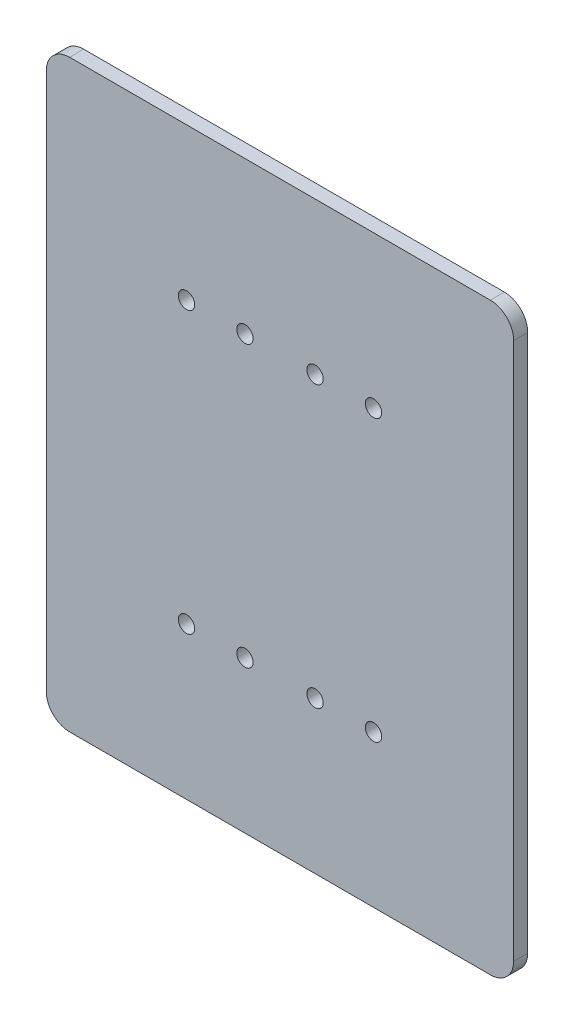
ISO-10303-21;
HEADER;
FILE_DESCRIPTION(('STEP AP214'),'2;1');
FILE_NAME('part.step','',(''),(''),'','','');
FILE_SCHEMA(('AUTOMOTIVE_DESIGN { 1 0 10303 214 1 1 1 1 }'));
ENDSEC;
DATA;
#1=APPLICATION_CONTEXT('core data for automotive mechanical design processes');
#2=APPLICATION_PROTOCOL_DEFINITION('international standard','automotive_design',2000,#1);
#3=PRODUCT_CONTEXT('',#1,'mechanical');
#4=PRODUCT('Part','Part','',(#3));
#5=PRODUCT_RELATED_PRODUCT_CATEGORY('part','',(#4));
#6=PRODUCT_DEFINITION_FORMATION('','',#4);
#7=PRODUCT_DEFINITION_CONTEXT('part definition',#1,'design');
#8=PRODUCT_DEFINITION('design','',#6,#7);
#9=PRODUCT_DEFINITION_SHAPE('','',#8);
#10=(LENGTH_UNIT() NAMED_UNIT(*) SI_UNIT(.MILLI.,.METRE.));
#11=(NAMED_UNIT(*) PLANE_ANGLE_UNIT() SI_UNIT($,.RADIAN.));
#12=(NAMED_UNIT(*) SI_UNIT($,.STERADIAN.) SOLID_ANGLE_UNIT());
#13=UNCERTAINTY_MEASURE_WITH_UNIT(LENGTH_MEASURE(1.E-05),#10,'distance_accuracy_value','');
#14=(GEOMETRIC_REPRESENTATION_CONTEXT(3) GLOBAL_UNCERTAINTY_ASSIGNED_CONTEXT((#13)) GLOBAL_UNIT_ASSIGNED_CONTEXT((#10,
#11,#12)) REPRESENTATION_CONTEXT('',''));
#15=CARTESIAN_POINT('',(0.,0.,0.));
#16=DIRECTION('',(0.,0.,1.));
#17=DIRECTION('',(1.,0.,0.));
#18=AXIS2_PLACEMENT_3D('',#15,#16,#17);
#19=CARTESIAN_POINT('',(0.,0.,6.));
#20=DIRECTION('',(1.,0.,0.));
#21=DIRECTION('',(0.,0.,-1.));
#22=AXIS2_PLACEMENT_3D('',#19,#20,#21);
#23=PLANE('',#22);
#24=DIRECTION('',(0.,-1.,0.));
#25=VECTOR('',#24,1.);
#26=CARTESIAN_POINT('',(0.,0.,6.));
#27=LINE('',#26,#25);
#28=CARTESIAN_POINT('',(0.,240.,6.));
#29=VERTEX_POINT('',#28);
#30=CARTESIAN_POINT('',(0.,10.,6.));
#31=VERTEX_POINT('',#30);
#32=EDGE_CURVE('E121',#29,#31,#27,.T.);
#33=ORIENTED_EDGE('',*,*,#32,.F.);
#34=DIRECTION('',(0.,0.,-1.));
#35=VECTOR('',#34,1.);
#36=CARTESIAN_POINT('',(0.,240.,6.));
#37=LINE('',#36,#35);
#38=CARTESIAN_POINT('',(0.,240.,0.));
#39=VERTEX_POINT('',#38);
#40=EDGE_CURVE('E106',#29,#39,#37,.T.);
#41=ORIENTED_EDGE('',*,*,#40,.T.);
#42=DIRECTION('',(0.,-1.,0.));
#43=VECTOR('',#42,1.);
#44=CARTESIAN_POINT('',(0.,0.,0.));
#45=LINE('',#44,#43);
#46=CARTESIAN_POINT('',(0.,10.,0.));
#47=VERTEX_POINT('',#46);
#48=EDGE_CURVE('E118',#39,#47,#45,.T.);
#49=ORIENTED_EDGE('',*,*,#48,.T.);
#50=DIRECTION('',(0.,0.,-1.));
#51=VECTOR('',#50,1.);
#52=CARTESIAN_POINT('',(0.,10.,6.));
#53=LINE('',#52,#51);
#54=EDGE_CURVE('E123',#47,#31,#53,.F.);
#55=ORIENTED_EDGE('',*,*,#54,.T.);
#56=EDGE_LOOP('',(#33,#41,#49,#55));
#57=FACE_BOUND('',#56,.T.);
#58=ADVANCED_FACE('F36',(#57),#23,.F.);
#59=CARTESIAN_POINT('',(0.,0.,6.));
#60=DIRECTION('',(0.,1.,0.));
#61=DIRECTION('',(-1.,0.,0.));
#62=AXIS2_PLACEMENT_3D('',#59,#60,#61);
#63=PLANE('',#62);
#64=DIRECTION('',(1.,0.,0.));
#65=VECTOR('',#64,1.);
#66=CARTESIAN_POINT('',(0.,0.,0.));
#67=LINE('',#66,#65);
#68=CARTESIAN_POINT('',(10.,0.,0.));
#69=VERTEX_POINT('',#68);
#70=CARTESIAN_POINT('',(190.,0.,0.));
#71=VERTEX_POINT('',#70);
#72=EDGE_CURVE('E127',#69,#71,#67,.T.);
#73=ORIENTED_EDGE('',*,*,#72,.T.);
#74=DIRECTION('',(0.,0.,-1.));
#75=VECTOR('',#74,1.);
#76=CARTESIAN_POINT('',(190.,0.,6.));
#77=LINE('',#76,#75);
#78=CARTESIAN_POINT('',(190.,0.,6.));
#79=VERTEX_POINT('',#78);
#80=EDGE_CURVE('E11',#71,#79,#77,.F.);
#81=ORIENTED_EDGE('',*,*,#80,.T.);
#82=DIRECTION('',(1.,0.,0.));
#83=VECTOR('',#82,1.);
#84=CARTESIAN_POINT('',(0.,0.,6.));
#85=LINE('',#84,#83);
#86=CARTESIAN_POINT('',(10.,0.,6.));
#87=VERTEX_POINT('',#86);
#88=EDGE_CURVE('E167',#87,#79,#85,.T.);
#89=ORIENTED_EDGE('',*,*,#88,.F.);
#90=DIRECTION('',(0.,0.,-1.));
#91=VECTOR('',#90,1.);
#92=CARTESIAN_POINT('',(10.,0.,6.));
#93=LINE('',#92,#91);
#94=EDGE_CURVE('E44',#87,#69,#93,.T.);
#95=ORIENTED_EDGE('',*,*,#94,.T.);
#96=EDGE_LOOP('',(#73,#81,#89,#95));
#97=FACE_BOUND('',#96,.T.);
#98=ADVANCED_FACE('F165',(#97),#63,.F.);
#99=CARTESIAN_POINT('',(200.,0.,6.));
#100=DIRECTION('',(-1.,0.,0.));
#101=DIRECTION('',(0.,-1.,0.));
#102=AXIS2_PLACEMENT_3D('',#99,#100,#101);
#103=PLANE('',#102);
#104=DIRECTION('',(0.,1.,0.));
#105=VECTOR('',#104,1.);
#106=CARTESIAN_POINT('',(200.,0.,0.));
#107=LINE('',#106,#105);
#108=CARTESIAN_POINT('',(200.,10.,0.));
#109=VERTEX_POINT('',#108);
#110=CARTESIAN_POINT('',(200.,240.,0.));
#111=VERTEX_POINT('',#110);
#112=EDGE_CURVE('E131',#109,#111,#107,.T.);
#113=ORIENTED_EDGE('',*,*,#112,.T.);
#114=DIRECTION('',(0.,0.,-1.));
#115=VECTOR('',#114,1.);
#116=CARTESIAN_POINT('',(200.,240.,6.));
#117=LINE('',#116,#115);
#118=CARTESIAN_POINT('',(200.,240.,6.));
#119=VERTEX_POINT('',#118);
#120=EDGE_CURVE('E51',#111,#119,#117,.F.);
#121=ORIENTED_EDGE('',*,*,#120,.T.);
#122=DIRECTION('',(0.,1.,0.));
#123=VECTOR('',#122,1.);
#124=CARTESIAN_POINT('',(200.,0.,6.));
#125=LINE('',#124,#123);
#126=CARTESIAN_POINT('',(200.,10.,6.));
#127=VERTEX_POINT('',#126);
#128=EDGE_CURVE('E175',#127,#119,#125,.T.);
#129=ORIENTED_EDGE('',*,*,#128,.F.);
#130=DIRECTION('',(0.,0.,-1.));
#131=VECTOR('',#130,1.);
#132=CARTESIAN_POINT('',(200.,10.,6.));
#133=LINE('',#132,#131);
#134=EDGE_CURVE('E158',#127,#109,#133,.T.);
#135=ORIENTED_EDGE('',*,*,#134,.T.);
#136=EDGE_LOOP('',(#113,#121,#129,#135));
#137=FACE_BOUND('',#136,.T.);
#138=ADVANCED_FACE('F174',(#137),#103,.F.);
#139=CARTESIAN_POINT('',(0.,250.,6.));
#140=DIRECTION('',(0.,-1.,0.));
#141=DIRECTION('',(0.,0.,-1.));
#142=AXIS2_PLACEMENT_3D('',#139,#140,#141);
#143=PLANE('',#142);
#144=DIRECTION('',(-1.,0.,0.));
#145=VECTOR('',#144,1.);
#146=CARTESIAN_POINT('',(0.,250.,0.));
#147=LINE('',#146,#145);
#148=CARTESIAN_POINT('',(190.,250.,0.));
#149=VERTEX_POINT('',#148);
#150=CARTESIAN_POINT('',(10.,250.,0.));
#151=VERTEX_POINT('',#150);
#152=EDGE_CURVE('E141',#149,#151,#147,.T.);
#153=ORIENTED_EDGE('',*,*,#152,.T.);
#154=DIRECTION('',(0.,0.,-1.));
#155=VECTOR('',#154,1.);
#156=CARTESIAN_POINT('',(10.,250.,6.));
#157=LINE('',#156,#155);
#158=CARTESIAN_POINT('',(10.,250.,6.));
#159=VERTEX_POINT('',#158);
#160=EDGE_CURVE('E107',#151,#159,#157,.F.);
#161=ORIENTED_EDGE('',*,*,#160,.T.);
#162=DIRECTION('',(-1.,0.,0.));
#163=VECTOR('',#162,1.);
#164=CARTESIAN_POINT('',(0.,250.,6.));
#165=LINE('',#164,#163);
#166=CARTESIAN_POINT('',(190.,250.,6.));
#167=VERTEX_POINT('',#166);
#168=EDGE_CURVE('E137',#167,#159,#165,.T.);
#169=ORIENTED_EDGE('',*,*,#168,.F.);
#170=DIRECTION('',(0.,0.,-1.));
#171=VECTOR('',#170,1.);
#172=CARTESIAN_POINT('',(190.,250.,6.));
#173=LINE('',#172,#171);
#174=EDGE_CURVE('E112',#167,#149,#173,.T.);
#175=ORIENTED_EDGE('',*,*,#174,.T.);
#176=EDGE_LOOP('',(#153,#161,#169,#175));
#177=FACE_BOUND('',#176,.T.);
#178=ADVANCED_FACE('F275',(#177),#143,.F.);
#179=CARTESIAN_POINT('',(0.,0.,6.));
#180=DIRECTION('',(0.,0.,-1.));
#181=DIRECTION('',(-1.,0.,0.));
#182=AXIS2_PLACEMENT_3D('',#179,#180,#181);
#183=PLANE('',#182);
#184=CARTESIAN_POINT('',(140.,185.,6.));
#185=DIRECTION('',(0.,0.,-1.));
#186=DIRECTION('',(-1.,0.,0.));
#187=AXIS2_PLACEMENT_3D('',#184,#185,#186);
#188=CIRCLE('',#187,3.49999999999999);
#189=CARTESIAN_POINT('',(136.5,185.,6.));
#190=VERTEX_POINT('',#189);
#191=EDGE_CURVE('E196',#190,#190,#188,.F.);
#192=ORIENTED_EDGE('',*,*,#191,.F.);
#193=EDGE_LOOP('',(#192));
#194=FACE_BOUND('',#193,.T.);
#195=CARTESIAN_POINT('',(115.,65.,6.));
#196=DIRECTION('',(0.,0.,-1.));
#197=DIRECTION('',(-1.,0.,0.));
#198=AXIS2_PLACEMENT_3D('',#195,#196,#197);
#199=CIRCLE('',#198,3.50000000000001);
#200=CARTESIAN_POINT('',(111.5,65.,6.));
#201=VERTEX_POINT('',#200);
#202=EDGE_CURVE('E191',#201,#201,#199,.F.);
#203=ORIENTED_EDGE('',*,*,#202,.F.);
#204=EDGE_LOOP('',(#203));
#205=FACE_BOUND('',#204,.T.);
#206=CARTESIAN_POINT('',(140.,65.,6.));
#207=DIRECTION('',(0.,0.,-1.));
#208=DIRECTION('',(-1.,0.,0.));
#209=AXIS2_PLACEMENT_3D('',#206,#207,#208);
#210=CIRCLE('',#209,3.49999999999999);
#211=CARTESIAN_POINT('',(136.5,65.,6.));
#212=VERTEX_POINT('',#211);
#213=EDGE_CURVE('E184',#212,#212,#210,.F.);
#214=ORIENTED_EDGE('',*,*,#213,.F.);
#215=EDGE_LOOP('',(#214));
#216=FACE_BOUND('',#215,.T.);
#217=CARTESIAN_POINT('',(85.,65.,6.));
#218=DIRECTION('',(0.,0.,-1.));
#219=DIRECTION('',(-1.,0.,0.));
#220=AXIS2_PLACEMENT_3D('',#217,#218,#219);
#221=CIRCLE('',#220,3.50000000000001);
#222=CARTESIAN_POINT('',(81.5,65.,6.));
#223=VERTEX_POINT('',#222);
#224=EDGE_CURVE('E183',#223,#223,#221,.F.);
#225=ORIENTED_EDGE('',*,*,#224,.F.);
#226=EDGE_LOOP('',(#225));
#227=FACE_BOUND('',#226,.T.);
#228=CARTESIAN_POINT('',(115.,185.,6.));
#229=DIRECTION('',(0.,0.,-1.));
#230=DIRECTION('',(-1.,0.,0.));
#231=AXIS2_PLACEMENT_3D('',#228,#229,#230);
#232=CIRCLE('',#231,3.50000000000001);
#233=CARTESIAN_POINT('',(111.5,185.,6.));
#234=VERTEX_POINT('',#233);
#235=EDGE_CURVE('E203',#234,#234,#232,.F.);
#236=ORIENTED_EDGE('',*,*,#235,.F.);
#237=EDGE_LOOP('',(#236));
#238=FACE_BOUND('',#237,.T.);
#239=CARTESIAN_POINT('',(85.,185.,6.));
#240=DIRECTION('',(0.,0.,-1.));
#241=DIRECTION('',(-1.,0.,0.));
#242=AXIS2_PLACEMENT_3D('',#239,#240,#241);
#243=CIRCLE('',#242,3.50000000000001);
#244=CARTESIAN_POINT('',(81.5,185.,6.));
#245=VERTEX_POINT('',#244);
#246=EDGE_CURVE('E215',#245,#245,#243,.F.);
#247=ORIENTED_EDGE('',*,*,#246,.F.);
#248=EDGE_LOOP('',(#247));
#249=FACE_BOUND('',#248,.T.);
#250=CARTESIAN_POINT('',(60.,185.,6.));
#251=DIRECTION('',(0.,0.,-1.));
#252=DIRECTION('',(-1.,0.,0.));
#253=AXIS2_PLACEMENT_3D('',#250,#251,#252);
#254=CIRCLE('',#253,3.5);
#255=CARTESIAN_POINT('',(56.5,185.,6.));
#256=VERTEX_POINT('',#255);
#257=EDGE_CURVE('E208',#256,#256,#254,.F.);
#258=ORIENTED_EDGE('',*,*,#257,.F.);
#259=EDGE_LOOP('',(#258));
#260=FACE_BOUND('',#259,.T.);
#261=CARTESIAN_POINT('',(60.,65.,6.));
#262=DIRECTION('',(0.,0.,-1.));
#263=DIRECTION('',(-1.,0.,0.));
#264=AXIS2_PLACEMENT_3D('',#261,#262,#263);
#265=CIRCLE('',#264,3.5);
#266=CARTESIAN_POINT('',(56.5,65.,6.));
#267=VERTEX_POINT('',#266);
#268=EDGE_CURVE('E128',#267,#267,#265,.F.);
#269=ORIENTED_EDGE('',*,*,#268,.F.);
#270=EDGE_LOOP('',(#269));
#271=FACE_BOUND('',#270,.T.);
#272=ORIENTED_EDGE('',*,*,#168,.T.);
#273=CARTESIAN_POINT('',(10.,240.,6.));
#274=DIRECTION('',(0.,0.,-1.));
#275=DIRECTION('',(-1.,0.,0.));
#276=AXIS2_PLACEMENT_3D('',#273,#274,#275);
#277=CIRCLE('',#276,10.);
#278=EDGE_CURVE('E156',#159,#29,#277,.F.);
#279=ORIENTED_EDGE('',*,*,#278,.T.);
#280=ORIENTED_EDGE('',*,*,#32,.T.);
#281=CARTESIAN_POINT('',(10.,10.,6.));
#282=DIRECTION('',(0.,0.,-1.));
#283=DIRECTION('',(-1.,0.,0.));
#284=AXIS2_PLACEMENT_3D('',#281,#282,#283);
#285=CIRCLE('',#284,10.);
#286=EDGE_CURVE('E151',#31,#87,#285,.F.);
#287=ORIENTED_EDGE('',*,*,#286,.T.);
#288=ORIENTED_EDGE('',*,*,#88,.T.);
#289=CARTESIAN_POINT('',(190.,10.,6.));
#290=DIRECTION('',(0.,0.,-1.));
#291=DIRECTION('',(-1.,0.,0.));
#292=AXIS2_PLACEMENT_3D('',#289,#290,#291);
#293=CIRCLE('',#292,10.);
#294=EDGE_CURVE('E58',#79,#127,#293,.F.);
#295=ORIENTED_EDGE('',*,*,#294,.T.);
#296=ORIENTED_EDGE('',*,*,#128,.T.);
#297=CARTESIAN_POINT('',(190.,240.,6.));
#298=DIRECTION('',(0.,0.,-1.));
#299=DIRECTION('',(-1.,0.,0.));
#300=AXIS2_PLACEMENT_3D('',#297,#298,#299);
#301=CIRCLE('',#300,10.);
#302=EDGE_CURVE('E154',#119,#167,#301,.F.);
#303=ORIENTED_EDGE('',*,*,#302,.T.);
#304=EDGE_LOOP('',(#272,#279,#280,#287,#288,#295,#296,#303));
#305=FACE_BOUND('',#304,.T.);
#306=ADVANCED_FACE('F231',(#194,#205,#216,#227,#238,#249,#260,#271,#305),#183,.F.);
#307=CARTESIAN_POINT('',(0.,0.,0.));
#308=DIRECTION('',(0.,0.,-1.));
#309=DIRECTION('',(-1.,0.,0.));
#310=AXIS2_PLACEMENT_3D('',#307,#308,#309);
#311=PLANE('',#310);
#312=CARTESIAN_POINT('',(140.,185.,0.));
#313=DIRECTION('',(0.,0.,-1.));
#314=DIRECTION('',(-1.,0.,0.));
#315=AXIS2_PLACEMENT_3D('',#312,#313,#314);
#316=CIRCLE('',#315,3.49999999999999);
#317=CARTESIAN_POINT('',(136.5,185.,0.));
#318=VERTEX_POINT('',#317);
#319=EDGE_CURVE('E200',#318,#318,#316,.T.);
#320=ORIENTED_EDGE('',*,*,#319,.F.);
#321=EDGE_LOOP('',(#320));
#322=FACE_BOUND('',#321,.T.);
#323=CARTESIAN_POINT('',(115.,65.,0.));
#324=DIRECTION('',(0.,0.,-1.));
#325=DIRECTION('',(-1.,0.,0.));
#326=AXIS2_PLACEMENT_3D('',#323,#324,#325);
#327=CIRCLE('',#326,3.50000000000001);
#328=CARTESIAN_POINT('',(111.5,65.,0.));
#329=VERTEX_POINT('',#328);
#330=EDGE_CURVE('E199',#329,#329,#327,.T.);
#331=ORIENTED_EDGE('',*,*,#330,.F.);
#332=EDGE_LOOP('',(#331));
#333=FACE_BOUND('',#332,.T.);
#334=CARTESIAN_POINT('',(140.,65.,0.));
#335=DIRECTION('',(0.,0.,-1.));
#336=DIRECTION('',(-1.,0.,0.));
#337=AXIS2_PLACEMENT_3D('',#334,#335,#336);
#338=CIRCLE('',#337,3.49999999999999);
#339=CARTESIAN_POINT('',(136.5,65.,0.));
#340=VERTEX_POINT('',#339);
#341=EDGE_CURVE('E188',#340,#340,#338,.T.);
#342=ORIENTED_EDGE('',*,*,#341,.F.);
#343=EDGE_LOOP('',(#342));
#344=FACE_BOUND('',#343,.T.);
#345=CARTESIAN_POINT('',(85.,65.,0.));
#346=DIRECTION('',(0.,0.,-1.));
#347=DIRECTION('',(-1.,0.,0.));
#348=AXIS2_PLACEMENT_3D('',#345,#346,#347);
#349=CIRCLE('',#348,3.50000000000001);
#350=CARTESIAN_POINT('',(81.5,65.,0.));
#351=VERTEX_POINT('',#350);
#352=EDGE_CURVE('E187',#351,#351,#349,.T.);
#353=ORIENTED_EDGE('',*,*,#352,.F.);
#354=EDGE_LOOP('',(#353));
#355=FACE_BOUND('',#354,.T.);
#356=CARTESIAN_POINT('',(115.,185.,0.));
#357=DIRECTION('',(0.,0.,-1.));
#358=DIRECTION('',(-1.,0.,0.));
#359=AXIS2_PLACEMENT_3D('',#356,#357,#358);
#360=CIRCLE('',#359,3.50000000000001);
#361=CARTESIAN_POINT('',(111.5,185.,0.));
#362=VERTEX_POINT('',#361);
#363=EDGE_CURVE('E218',#362,#362,#360,.T.);
#364=ORIENTED_EDGE('',*,*,#363,.F.);
#365=EDGE_LOOP('',(#364));
#366=FACE_BOUND('',#365,.T.);
#367=CARTESIAN_POINT('',(85.,185.,0.));
#368=DIRECTION('',(0.,0.,-1.));
#369=DIRECTION('',(-1.,0.,0.));
#370=AXIS2_PLACEMENT_3D('',#367,#368,#369);
#371=CIRCLE('',#370,3.50000000000001);
#372=CARTESIAN_POINT('',(81.5,185.,0.));
#373=VERTEX_POINT('',#372);
#374=EDGE_CURVE('E211',#373,#373,#371,.T.);
#375=ORIENTED_EDGE('',*,*,#374,.F.);
#376=EDGE_LOOP('',(#375));
#377=FACE_BOUND('',#376,.T.);
#378=CARTESIAN_POINT('',(60.,185.,0.));
#379=DIRECTION('',(0.,0.,-1.));
#380=DIRECTION('',(-1.,0.,0.));
#381=AXIS2_PLACEMENT_3D('',#378,#379,#380);
#382=CIRCLE('',#381,3.5);
#383=CARTESIAN_POINT('',(56.5,185.,0.));
#384=VERTEX_POINT('',#383);
#385=EDGE_CURVE('E212',#384,#384,#382,.T.);
#386=ORIENTED_EDGE('',*,*,#385,.F.);
#387=EDGE_LOOP('',(#386));
#388=FACE_BOUND('',#387,.T.);
#389=CARTESIAN_POINT('',(60.,65.,0.));
#390=DIRECTION('',(0.,0.,-1.));
#391=DIRECTION('',(-1.,0.,0.));
#392=AXIS2_PLACEMENT_3D('',#389,#390,#391);
#393=CIRCLE('',#392,3.5);
#394=CARTESIAN_POINT('',(56.5,65.,0.));
#395=VERTEX_POINT('',#394);
#396=EDGE_CURVE('E134',#395,#395,#393,.T.);
#397=ORIENTED_EDGE('',*,*,#396,.F.);
#398=EDGE_LOOP('',(#397));
#399=FACE_BOUND('',#398,.T.);
#400=ORIENTED_EDGE('',*,*,#48,.F.);
#401=CARTESIAN_POINT('',(10.,240.,0.));
#402=DIRECTION('',(0.,0.,-1.));
#403=DIRECTION('',(-1.,0.,0.));
#404=AXIS2_PLACEMENT_3D('',#401,#402,#403);
#405=CIRCLE('',#404,10.);
#406=EDGE_CURVE('E102',#39,#151,#405,.T.);
#407=ORIENTED_EDGE('',*,*,#406,.T.);
#408=ORIENTED_EDGE('',*,*,#152,.F.);
#409=CARTESIAN_POINT('',(190.,240.,0.));
#410=DIRECTION('',(0.,0.,-1.));
#411=DIRECTION('',(-1.,0.,0.));
#412=AXIS2_PLACEMENT_3D('',#409,#410,#411);
#413=CIRCLE('',#412,10.);
#414=EDGE_CURVE('E113',#149,#111,#413,.T.);
#415=ORIENTED_EDGE('',*,*,#414,.T.);
#416=ORIENTED_EDGE('',*,*,#112,.F.);
#417=CARTESIAN_POINT('',(190.,10.,0.));
#418=DIRECTION('',(0.,0.,-1.));
#419=DIRECTION('',(-1.,0.,0.));
#420=AXIS2_PLACEMENT_3D('',#417,#418,#419);
#421=CIRCLE('',#420,10.);
#422=EDGE_CURVE('E145',#109,#71,#421,.T.);
#423=ORIENTED_EDGE('',*,*,#422,.T.);
#424=ORIENTED_EDGE('',*,*,#72,.F.);
#425=CARTESIAN_POINT('',(10.,10.,0.));
#426=DIRECTION('',(0.,0.,-1.));
#427=DIRECTION('',(-1.,0.,0.));
#428=AXIS2_PLACEMENT_3D('',#425,#426,#427);
#429=CIRCLE('',#428,10.);
#430=EDGE_CURVE('E122',#69,#47,#429,.T.);
#431=ORIENTED_EDGE('',*,*,#430,.T.);
#432=EDGE_LOOP('',(#400,#407,#408,#415,#416,#423,#424,#431));
#433=FACE_BOUND('',#432,.T.);
#434=ADVANCED_FACE('F125',(#322,#333,#344,#355,#366,#377,#388,#399,#433),#311,.T.);
#435=CARTESIAN_POINT('',(60.,65.,15.8994949366117));
#436=DIRECTION('',(0.,0.,-1.));
#437=DIRECTION('',(-1.,0.,0.));
#438=AXIS2_PLACEMENT_3D('',#435,#436,#437);
#439=CYLINDRICAL_SURFACE('',#438,3.5);
#440=ORIENTED_EDGE('',*,*,#268,.T.);
#441=EDGE_LOOP('',(#440));
#442=FACE_BOUND('',#441,.T.);
#443=ORIENTED_EDGE('',*,*,#396,.T.);
#444=EDGE_LOOP('',(#443));
#445=FACE_BOUND('',#444,.T.);
#446=ADVANCED_FACE('F230',(#442,#445),#439,.F.);
#447=CARTESIAN_POINT('',(60.,185.,15.8994949366117));
#448=DIRECTION('',(0.,0.,-1.));
#449=DIRECTION('',(-1.,0.,0.));
#450=AXIS2_PLACEMENT_3D('',#447,#448,#449);
#451=CYLINDRICAL_SURFACE('',#450,3.5);
#452=ORIENTED_EDGE('',*,*,#257,.T.);
#453=EDGE_LOOP('',(#452));
#454=FACE_BOUND('',#453,.T.);
#455=ORIENTED_EDGE('',*,*,#385,.T.);
#456=EDGE_LOOP('',(#455));
#457=FACE_BOUND('',#456,.T.);
#458=ADVANCED_FACE('F241',(#454,#457),#451,.F.);
#459=CARTESIAN_POINT('',(85.,185.,15.8994949366117));
#460=DIRECTION('',(0.,0.,-1.));
#461=DIRECTION('',(-1.,0.,0.));
#462=AXIS2_PLACEMENT_3D('',#459,#460,#461);
#463=CYLINDRICAL_SURFACE('',#462,3.50000000000001);
#464=ORIENTED_EDGE('',*,*,#246,.T.);
#465=EDGE_LOOP('',(#464));
#466=FACE_BOUND('',#465,.T.);
#467=ORIENTED_EDGE('',*,*,#374,.T.);
#468=EDGE_LOOP('',(#467));
#469=FACE_BOUND('',#468,.T.);
#470=ADVANCED_FACE('F247',(#466,#469),#463,.F.);
#471=CARTESIAN_POINT('',(115.,185.,15.8994949366117));
#472=DIRECTION('',(0.,0.,-1.));
#473=DIRECTION('',(-1.,0.,0.));
#474=AXIS2_PLACEMENT_3D('',#471,#472,#473);
#475=CYLINDRICAL_SURFACE('',#474,3.50000000000001);
#476=ORIENTED_EDGE('',*,*,#235,.T.);
#477=EDGE_LOOP('',(#476));
#478=FACE_BOUND('',#477,.T.);
#479=ORIENTED_EDGE('',*,*,#363,.T.);
#480=EDGE_LOOP('',(#479));
#481=FACE_BOUND('',#480,.T.);
#482=ADVANCED_FACE('F226',(#478,#481),#475,.F.);
#483=CARTESIAN_POINT('',(85.,65.,15.8994949366117));
#484=DIRECTION('',(0.,0.,-1.));
#485=DIRECTION('',(-1.,0.,0.));
#486=AXIS2_PLACEMENT_3D('',#483,#484,#485);
#487=CYLINDRICAL_SURFACE('',#486,3.50000000000001);
#488=ORIENTED_EDGE('',*,*,#224,.T.);
#489=EDGE_LOOP('',(#488));
#490=FACE_BOUND('',#489,.T.);
#491=ORIENTED_EDGE('',*,*,#352,.T.);
#492=EDGE_LOOP('',(#491));
#493=FACE_BOUND('',#492,.T.);
#494=ADVANCED_FACE('F323',(#490,#493),#487,.F.);
#495=CARTESIAN_POINT('',(140.,65.,15.8994949366117));
#496=DIRECTION('',(0.,0.,-1.));
#497=DIRECTION('',(-1.,0.,0.));
#498=AXIS2_PLACEMENT_3D('',#495,#496,#497);
#499=CYLINDRICAL_SURFACE('',#498,3.49999999999999);
#500=ORIENTED_EDGE('',*,*,#213,.T.);
#501=EDGE_LOOP('',(#500));
#502=FACE_BOUND('',#501,.T.);
#503=ORIENTED_EDGE('',*,*,#341,.T.);
#504=EDGE_LOOP('',(#503));
#505=FACE_BOUND('',#504,.T.);
#506=ADVANCED_FACE('F313',(#502,#505),#499,.F.);
#507=CARTESIAN_POINT('',(115.,65.,15.8994949366117));
#508=DIRECTION('',(0.,0.,-1.));
#509=DIRECTION('',(-1.,0.,0.));
#510=AXIS2_PLACEMENT_3D('',#507,#508,#509);
#511=CYLINDRICAL_SURFACE('',#510,3.50000000000001);
#512=ORIENTED_EDGE('',*,*,#202,.T.);
#513=EDGE_LOOP('',(#512));
#514=FACE_BOUND('',#513,.T.);
#515=ORIENTED_EDGE('',*,*,#330,.T.);
#516=EDGE_LOOP('',(#515));
#517=FACE_BOUND('',#516,.T.);
#518=ADVANCED_FACE('F302',(#514,#517),#511,.F.);
#519=CARTESIAN_POINT('',(140.,185.,15.8994949366117));
#520=DIRECTION('',(0.,0.,-1.));
#521=DIRECTION('',(-1.,0.,0.));
#522=AXIS2_PLACEMENT_3D('',#519,#520,#521);
#523=CYLINDRICAL_SURFACE('',#522,3.49999999999999);
#524=ORIENTED_EDGE('',*,*,#191,.T.);
#525=EDGE_LOOP('',(#524));
#526=FACE_BOUND('',#525,.T.);
#527=ORIENTED_EDGE('',*,*,#319,.T.);
#528=EDGE_LOOP('',(#527));
#529=FACE_BOUND('',#528,.T.);
#530=ADVANCED_FACE('F263',(#526,#529),#523,.F.);
#531=CARTESIAN_POINT('',(10.,240.,6.));
#532=DIRECTION('',(0.,0.,-1.));
#533=DIRECTION('',(-1.,0.,0.));
#534=AXIS2_PLACEMENT_3D('',#531,#532,#533);
#535=CYLINDRICAL_SURFACE('',#534,10.);
#536=ORIENTED_EDGE('',*,*,#278,.F.);
#537=ORIENTED_EDGE('',*,*,#160,.F.);
#538=ORIENTED_EDGE('',*,*,#406,.F.);
#539=ORIENTED_EDGE('',*,*,#40,.F.);
#540=EDGE_LOOP('',(#536,#537,#538,#539));
#541=FACE_BOUND('',#540,.T.);
#542=ADVANCED_FACE('F105',(#541),#535,.T.);
#543=CARTESIAN_POINT('',(190.,240.,6.));
#544=DIRECTION('',(0.,0.,-1.));
#545=DIRECTION('',(-1.,0.,0.));
#546=AXIS2_PLACEMENT_3D('',#543,#544,#545);
#547=CYLINDRICAL_SURFACE('',#546,10.);
#548=ORIENTED_EDGE('',*,*,#302,.F.);
#549=ORIENTED_EDGE('',*,*,#120,.F.);
#550=ORIENTED_EDGE('',*,*,#414,.F.);
#551=ORIENTED_EDGE('',*,*,#174,.F.);
#552=EDGE_LOOP('',(#548,#549,#550,#551));
#553=FACE_BOUND('',#552,.T.);
#554=ADVANCED_FACE('F262',(#553),#547,.T.);
#555=CARTESIAN_POINT('',(190.,10.,6.));
#556=DIRECTION('',(0.,0.,-1.));
#557=DIRECTION('',(-1.,0.,0.));
#558=AXIS2_PLACEMENT_3D('',#555,#556,#557);
#559=CYLINDRICAL_SURFACE('',#558,10.);
#560=ORIENTED_EDGE('',*,*,#294,.F.);
#561=ORIENTED_EDGE('',*,*,#80,.F.);
#562=ORIENTED_EDGE('',*,*,#422,.F.);
#563=ORIENTED_EDGE('',*,*,#134,.F.);
#564=EDGE_LOOP('',(#560,#561,#562,#563));
#565=FACE_BOUND('',#564,.T.);
#566=ADVANCED_FACE('F173',(#565),#559,.T.);
#567=CARTESIAN_POINT('',(10.,10.,6.));
#568=DIRECTION('',(0.,0.,-1.));
#569=DIRECTION('',(-1.,0.,0.));
#570=AXIS2_PLACEMENT_3D('',#567,#568,#569);
#571=CYLINDRICAL_SURFACE('',#570,10.);
#572=ORIENTED_EDGE('',*,*,#286,.F.);
#573=ORIENTED_EDGE('',*,*,#54,.F.);
#574=ORIENTED_EDGE('',*,*,#430,.F.);
#575=ORIENTED_EDGE('',*,*,#94,.F.);
#576=EDGE_LOOP('',(#572,#573,#574,#575));
#577=FACE_BOUND('',#576,.T.);
#578=ADVANCED_FACE('F38',(#577),#571,.T.);
#579=CLOSED_SHELL('',(#58,#98,#138,#178,#306,#434,#446,#458,#470,#482,#494,#506,#518,#530,#542,
#554,#566,#578));
#580=MANIFOLD_SOLID_BREP('B2',#579);
#581=ADVANCED_BREP_SHAPE_REPRESENTATION('',(#18,#580),#14);
#582=SHAPE_DEFINITION_REPRESENTATION(#9,#581);
ENDSEC;
END-ISO-10303-21;
